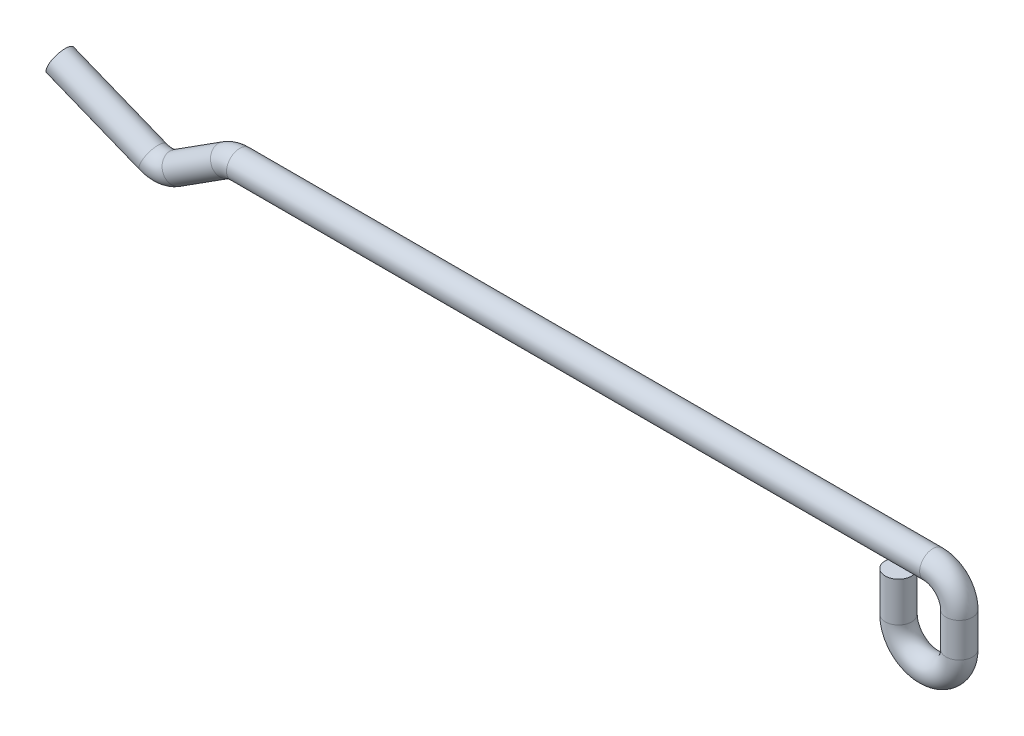
ISO-10303-21;
HEADER;
FILE_DESCRIPTION(('STEP AP214'),'2;1');
FILE_NAME('part.step','',(''),(''),'','','');
FILE_SCHEMA(('AUTOMOTIVE_DESIGN { 1 0 10303 214 1 1 1 1 }'));
ENDSEC;
DATA;
#1=APPLICATION_CONTEXT('core data for automotive mechanical design processes');
#2=APPLICATION_PROTOCOL_DEFINITION('international standard','automotive_design',2000,#1);
#3=PRODUCT_CONTEXT('',#1,'mechanical');
#4=PRODUCT('Part','Part','',(#3));
#5=PRODUCT_RELATED_PRODUCT_CATEGORY('part','',(#4));
#6=PRODUCT_DEFINITION_FORMATION('','',#4);
#7=PRODUCT_DEFINITION_CONTEXT('part definition',#1,'design');
#8=PRODUCT_DEFINITION('design','',#6,#7);
#9=PRODUCT_DEFINITION_SHAPE('','',#8);
#10=(LENGTH_UNIT() NAMED_UNIT(*) SI_UNIT(.MILLI.,.METRE.));
#11=(NAMED_UNIT(*) PLANE_ANGLE_UNIT() SI_UNIT($,.RADIAN.));
#12=(NAMED_UNIT(*) SI_UNIT($,.STERADIAN.) SOLID_ANGLE_UNIT());
#13=UNCERTAINTY_MEASURE_WITH_UNIT(LENGTH_MEASURE(1.E-05),#10,'distance_accuracy_value','');
#14=(GEOMETRIC_REPRESENTATION_CONTEXT(3) GLOBAL_UNCERTAINTY_ASSIGNED_CONTEXT((#13)) GLOBAL_UNIT_ASSIGNED_CONTEXT((#10,
#11,#12)) REPRESENTATION_CONTEXT('',''));
#15=CARTESIAN_POINT('',(0.,0.,0.));
#16=DIRECTION('',(0.,0.,1.));
#17=DIRECTION('',(1.,0.,0.));
#18=AXIS2_PLACEMENT_3D('',#15,#16,#17);
#19=CARTESIAN_POINT('',(-56.3710232392201,-1.2177613136877,0.));
#20=DIRECTION('',(-0.928195443882563,0.372093023255814,0.));
#21=DIRECTION('',(-0.372093023255814,-0.928195443882563,0.));
#22=AXIS2_PLACEMENT_3D('',#19,#20,#21);
#23=CYLINDRICAL_SURFACE('',#22,1.);
#24=CARTESIAN_POINT('',(-56.3710232392201,-1.2177613136877,0.));
#25=DIRECTION('',(-0.928195443882568,0.372093023255802,0.));
#26=DIRECTION('',(0.,0.,-1.));
#27=AXIS2_PLACEMENT_3D('',#24,#25,#26);
#28=CIRCLE('',#27,1.);
#29=CARTESIAN_POINT('',(-56.7431162624759,-2.14595675757027,0.));
#30=VERTEX_POINT('',#29);
#31=EDGE_CURVE('E45',#30,#30,#28,.T.);
#32=CARTESIAN_POINT('',(-63.4,1.6,0.));
#33=DIRECTION('',(-0.928195443882568,0.372093023255802,0.));
#34=DIRECTION('',(0.,0.,-1.));
#35=AXIS2_PLACEMENT_3D('',#32,#33,#34);
#36=CIRCLE('',#35,1.);
#37=CARTESIAN_POINT('',(-63.7720930232558,0.671804556117432,0.));
#38=VERTEX_POINT('',#37);
#39=EDGE_CURVE('E10',#38,#38,#36,.T.);
#40=CARTESIAN_POINT('',(-56.7431162624759,-2.14595675757027,0.));
#41=CARTESIAN_POINT('',(-56.8163347704007,-2.11660507721935,0.));
#42=CARTESIAN_POINT('',(-56.8895532783255,-2.08725339686844,0.));
#43=CARTESIAN_POINT('',(-57.0359902941751,-2.02855003616661,0.));
#44=CARTESIAN_POINT('',(-57.1092088020998,-1.9991983558157,0.));
#45=CARTESIAN_POINT('',(-57.2556458179494,-1.94049499511387,0.));
#46=CARTESIAN_POINT('',(-57.3288643258742,-1.91114331476296,0.));
#47=CARTESIAN_POINT('',(-57.4753013417238,-1.85243995406113,0.));
#48=CARTESIAN_POINT('',(-57.5485198496486,-1.82308827371022,0.));
#49=CARTESIAN_POINT('',(-57.6949568654982,-1.76438491300839,0.));
#50=CARTESIAN_POINT('',(-57.768175373423,-1.73503323265748,0.));
#51=CARTESIAN_POINT('',(-57.9146123892726,-1.67632987195565,0.));
#52=CARTESIAN_POINT('',(-57.9878308971973,-1.64697819160474,0.));
#53=CARTESIAN_POINT('',(-58.1342679130469,-1.58827483090291,0.));
#54=CARTESIAN_POINT('',(-58.2074864209717,-1.55892315055199,0.));
#55=CARTESIAN_POINT('',(-58.3539234368213,-1.50021978985017,0.));
#56=CARTESIAN_POINT('',(-58.4271419447461,-1.47086810949926,0.));
#57=CARTESIAN_POINT('',(-58.5735789605957,-1.41216474879743,0.));
#58=CARTESIAN_POINT('',(-58.6467974685205,-1.38281306844651,0.));
#59=CARTESIAN_POINT('',(-58.79323448437,-1.32410970774469,0.));
#60=CARTESIAN_POINT('',(-58.8664529922948,-1.29475802739377,0.));
#61=CARTESIAN_POINT('',(-59.0128900081444,-1.23605466669195,0.));
#62=CARTESIAN_POINT('',(-59.0861085160692,-1.20670298634103,0.));
#63=CARTESIAN_POINT('',(-59.2325455319188,-1.14799962563921,0.));
#64=CARTESIAN_POINT('',(-59.3057640398436,-1.11864794528829,0.));
#65=CARTESIAN_POINT('',(-59.4522010556932,-1.05994458458647,0.));
#66=CARTESIAN_POINT('',(-59.525419563618,-1.03059290423555,0.));
#67=CARTESIAN_POINT('',(-59.6718565794675,-0.971889543533725,0.));
#68=CARTESIAN_POINT('',(-59.7450750873923,-0.942537863182811,0.));
#69=CARTESIAN_POINT('',(-59.8915121032419,-0.883834502480984,0.));
#70=CARTESIAN_POINT('',(-59.9647306111667,-0.854482822130071,0.));
#71=CARTESIAN_POINT('',(-60.1111676270163,-0.795779461428244,0.));
#72=CARTESIAN_POINT('',(-60.1843861349411,-0.76642778107733,0.));
#73=CARTESIAN_POINT('',(-60.3308231507907,-0.707724420375503,0.));
#74=CARTESIAN_POINT('',(-60.4040416587154,-0.67837274002459,0.));
#75=CARTESIAN_POINT('',(-60.550478674565,-0.619669379322764,0.));
#76=CARTESIAN_POINT('',(-60.6236971824898,-0.590317698971849,0.));
#77=CARTESIAN_POINT('',(-60.7701341983394,-0.531614338270022,0.));
#78=CARTESIAN_POINT('',(-60.8433527062642,-0.502262657919108,0.));
#79=CARTESIAN_POINT('',(-60.9897897221138,-0.443559297217282,0.));
#80=CARTESIAN_POINT('',(-61.0630082300386,-0.414207616866369,0.));
#81=CARTESIAN_POINT('',(-61.2094452458882,-0.355504256164542,0.));
#82=CARTESIAN_POINT('',(-61.2826637538129,-0.326152575813627,0.));
#83=CARTESIAN_POINT('',(-61.4291007696625,-0.2674492151118,0.));
#84=CARTESIAN_POINT('',(-61.5023192775873,-0.238097534760888,0.));
#85=CARTESIAN_POINT('',(-61.6487562934369,-0.179394174059061,0.));
#86=CARTESIAN_POINT('',(-61.7219748013617,-0.150042493708146,0.));
#87=CARTESIAN_POINT('',(-61.8684118172113,-0.0913391330063192,0.));
#88=CARTESIAN_POINT('',(-61.9416303251361,-0.0619874526554063,0.));
#89=CARTESIAN_POINT('',(-62.0880673409856,-0.00328409195357959,0.));
#90=CARTESIAN_POINT('',(-62.1612858489104,0.0260675883973342,0.));
#91=CARTESIAN_POINT('',(-62.30772286476,0.0847709490991613,0.));
#92=CARTESIAN_POINT('',(-62.3809413726848,0.114122629450075,0.));
#93=CARTESIAN_POINT('',(-62.5273783885344,0.172825990151902,0.));
#94=CARTESIAN_POINT('',(-62.6005968964592,0.202177670502817,0.));
#95=CARTESIAN_POINT('',(-62.7470339123088,0.260881031204643,0.));
#96=CARTESIAN_POINT('',(-62.8202524202336,0.290232711555555,0.));
#97=CARTESIAN_POINT('',(-62.9666894360831,0.348936072257382,0.));
#98=CARTESIAN_POINT('',(-63.0399079440079,0.378287752608296,0.));
#99=CARTESIAN_POINT('',(-63.1863449598575,0.436991113310124,0.));
#100=CARTESIAN_POINT('',(-63.2595634677823,0.466342793661037,0.));
#101=CARTESIAN_POINT('',(-63.4060004836319,0.525046154362864,0.));
#102=CARTESIAN_POINT('',(-63.4792189915567,0.554397834713778,0.));
#103=CARTESIAN_POINT('',(-63.6256560074062,0.613101195415605,0.));
#104=CARTESIAN_POINT('',(-63.698874515331,0.642452875766518,0.));
#105=CARTESIAN_POINT('',(-63.7720930232558,0.671804556117432,0.));
#106=B_SPLINE_CURVE_WITH_KNOTS('',3,(#40,#41,#42,#43,#44,#45,#46,#47,#48,#49,#50,#51,#52,#53,
#54,#55,#56,#57,#58,#59,#60,#61,#62,#63,#64,#65,#66,#67,#68,#69,#70,#71,#72,#73,#74,#75,#76,#77,
#78,#79,#80,#81,#82,#83,#84,#85,#86,#87,#88,#89,#90,#91,#92,#93,#94,#95,#96,#97,#98,#99,#100,
#101,#102,#103,#104,#105),.UNSPECIFIED.,.F.,.F.,(4,2,2,2,2,2,2,2,2,2,2,2,2,2,2,2,2,2,2,2,2,2,2,
2,2,2,2,2,2,2,2,2,4),(0.,0.236647922829238,0.473295845658475,0.709943768487719,
0.946591691316957,1.1832396141462,1.41988753697544,1.65653545980468,1.89318338263392,
2.12983130546316,2.3664792282924,2.60312715112164,2.83977507395088,3.07642299678012,
3.31307091960936,3.5497188424386,3.78636676526784,4.02301468809708,4.25966261092632,
4.49631053375556,4.7329584565848,4.96960637941404,5.20625430224328,5.44290222507252,
5.67955014790176,5.916198070731,6.15284599356024,6.38949391638948,6.62614183921873,
6.86278976204797,7.0994376848772,7.33608560770644,7.57273353053568),.UNSPECIFIED.);
#107=EDGE_CURVE('BSEAM39',#30,#38,#106,.T.);
#108=ORIENTED_EDGE('',*,*,#31,.T.);
#109=ORIENTED_EDGE('',*,*,#39,.F.);
#110=ORIENTED_EDGE('',*,*,#107,.T.);
#111=ORIENTED_EDGE('',*,*,#107,.F.);
#112=EDGE_LOOP('',(#108,#110,#109,#111));
#113=FACE_BOUND('',#112,.T.);
#114=ADVANCED_FACE('F39',(#113),#23,.T.);
#115=CARTESIAN_POINT('',(-55.6268371927084,0.638629574077423,0.));
#116=DIRECTION('',(0.,0.,1.));
#117=DIRECTION('',(-1.,0.,0.));
#118=AXIS2_PLACEMENT_3D('',#115,#116,#117);
#119=TOROIDAL_SURFACE('',#118,2.,1.);
#120=CARTESIAN_POINT('',(-54.5514043560066,-1.04762195334767,0.));
#121=DIRECTION('',(-0.843125763712528,-0.537716418350942,0.));
#122=DIRECTION('',(0.,0.,-1.));
#123=AXIS2_PLACEMENT_3D('',#120,#121,#122);
#124=CIRCLE('',#123,1.);
#125=CARTESIAN_POINT('',(-54.0136879376557,-1.89074771706021,0.));
#126=VERTEX_POINT('',#125);
#127=EDGE_CURVE('E49',#126,#126,#124,.T.);
#128=CARTESIAN_POINT('',(-55.6268371927084,0.638629574077423,0.));
#129=DIRECTION('',(0.,0.,1.));
#130=DIRECTION('',(-1.,0.,0.));
#131=AXIS2_PLACEMENT_3D('',#128,#129,#130);
#132=CIRCLE('',#131,3.);
#133=EDGE_CURVE('',#30,#126,#132,.T.);
#134=ORIENTED_EDGE('',*,*,#31,.F.);
#135=ORIENTED_EDGE('',*,*,#127,.T.);
#136=ORIENTED_EDGE('',*,*,#133,.T.);
#137=ORIENTED_EDGE('',*,*,#133,.F.);
#138=EDGE_LOOP('',(#134,#136,#135,#137));
#139=FACE_BOUND('',#138,.T.);
#140=ADVANCED_FACE('F95',(#139),#119,.T.);
#141=CARTESIAN_POINT('',(-50.8919496811435,1.28625152742505,0.));
#142=DIRECTION('',(-0.843125763712536,-0.53771641835093,0.));
#143=DIRECTION('',(0.53771641835093,-0.843125763712537,0.));
#144=AXIS2_PLACEMENT_3D('',#141,#142,#143);
#145=CYLINDRICAL_SURFACE('',#144,1.);
#146=CARTESIAN_POINT('',(-50.8919496811435,1.28625152742505,0.));
#147=DIRECTION('',(-0.843125763712528,-0.537716418350942,0.));
#148=DIRECTION('',(0.,0.,-1.));
#149=AXIS2_PLACEMENT_3D('',#146,#147,#148);
#150=CIRCLE('',#149,1.);
#151=CARTESIAN_POINT('',(-51.4296660994945,2.12937729113758,0.));
#152=VERTEX_POINT('',#151);
#153=EDGE_CURVE('E53',#152,#152,#150,.T.);
#154=ORIENTED_EDGE('',*,*,#153,.T.);
#155=EDGE_LOOP('',(#154));
#156=FACE_BOUND('',#155,.T.);
#157=ORIENTED_EDGE('',*,*,#127,.F.);
#158=EDGE_LOOP('',(#157));
#159=FACE_BOUND('',#158,.T.);
#160=ADVANCED_FACE('F99',(#156,#159),#145,.T.);
#161=CARTESIAN_POINT('',(-49.8165168444417,-0.400000000000007,0.));
#162=DIRECTION('',(0.,0.,-1.));
#163=DIRECTION('',(1.,0.,0.));
#164=AXIS2_PLACEMENT_3D('',#161,#162,#163);
#165=TOROIDAL_SURFACE('',#164,2.,1.);
#166=CARTESIAN_POINT('',(-49.8165168444417,1.59999999999999,0.));
#167=DIRECTION('',(-1.,0.,0.));
#168=DIRECTION('',(0.,0.,-1.));
#169=AXIS2_PLACEMENT_3D('',#166,#167,#168);
#170=CIRCLE('',#169,1.);
#171=CARTESIAN_POINT('',(-49.8165168444417,2.59999999999999,0.));
#172=VERTEX_POINT('',#171);
#173=EDGE_CURVE('E58',#172,#172,#170,.T.);
#174=CARTESIAN_POINT('',(-49.8165168444417,-0.400000000000007,0.));
#175=DIRECTION('',(0.,0.,-1.));
#176=DIRECTION('',(1.,0.,0.));
#177=AXIS2_PLACEMENT_3D('',#174,#175,#176);
#178=CIRCLE('',#177,3.);
#179=EDGE_CURVE('',#152,#172,#178,.T.);
#180=ORIENTED_EDGE('',*,*,#153,.F.);
#181=ORIENTED_EDGE('',*,*,#173,.T.);
#182=ORIENTED_EDGE('',*,*,#179,.T.);
#183=ORIENTED_EDGE('',*,*,#179,.F.);
#184=EDGE_LOOP('',(#180,#182,#181,#183));
#185=FACE_BOUND('',#184,.T.);
#186=ADVANCED_FACE('F105',(#185),#165,.T.);
#187=CARTESIAN_POINT('',(2.59999999999997,1.6,0.));
#188=DIRECTION('',(-1.,0.,0.));
#189=DIRECTION('',(0.,-1.,0.));
#190=AXIS2_PLACEMENT_3D('',#187,#188,#189);
#191=CYLINDRICAL_SURFACE('',#190,1.);
#192=CARTESIAN_POINT('',(2.59999999999997,1.6,0.));
#193=DIRECTION('',(-1.,0.,0.));
#194=DIRECTION('',(0.,0.,-1.));
#195=AXIS2_PLACEMENT_3D('',#192,#193,#194);
#196=CIRCLE('',#195,1.);
#197=CARTESIAN_POINT('',(2.59999999999995,2.6,0.));
#198=VERTEX_POINT('',#197);
#199=EDGE_CURVE('E61',#198,#198,#196,.T.);
#200=ORIENTED_EDGE('',*,*,#199,.T.);
#201=EDGE_LOOP('',(#200));
#202=FACE_BOUND('',#201,.T.);
#203=ORIENTED_EDGE('',*,*,#173,.F.);
#204=EDGE_LOOP('',(#203));
#205=FACE_BOUND('',#204,.T.);
#206=ADVANCED_FACE('F112',(#202,#205),#191,.T.);
#207=CARTESIAN_POINT('',(2.6,-0.4,0.));
#208=DIRECTION('',(0.,0.,-1.));
#209=DIRECTION('',(1.,0.,0.));
#210=AXIS2_PLACEMENT_3D('',#207,#208,#209);
#211=TOROIDAL_SURFACE('',#210,2.,1.);
#212=CARTESIAN_POINT('',(4.6,-0.399999999999969,0.));
#213=DIRECTION('',(0.,1.,0.));
#214=DIRECTION('',(0.,0.,-1.));
#215=AXIS2_PLACEMENT_3D('',#212,#213,#214);
#216=CIRCLE('',#215,1.);
#217=CARTESIAN_POINT('',(5.6,-0.399999999999953,0.));
#218=VERTEX_POINT('',#217);
#219=EDGE_CURVE('E64',#218,#218,#216,.T.);
#220=CARTESIAN_POINT('',(2.6,-0.4,0.));
#221=DIRECTION('',(0.,0.,-1.));
#222=DIRECTION('',(1.,0.,0.));
#223=AXIS2_PLACEMENT_3D('',#220,#221,#222);
#224=CIRCLE('',#223,3.);
#225=EDGE_CURVE('',#198,#218,#224,.T.);
#226=ORIENTED_EDGE('',*,*,#199,.F.);
#227=ORIENTED_EDGE('',*,*,#219,.T.);
#228=ORIENTED_EDGE('',*,*,#225,.T.);
#229=ORIENTED_EDGE('',*,*,#225,.F.);
#230=EDGE_LOOP('',(#226,#228,#227,#229));
#231=FACE_BOUND('',#230,.T.);
#232=ADVANCED_FACE('F116',(#231),#211,.T.);
#233=CARTESIAN_POINT('',(4.6,-2.99999999999997,0.));
#234=DIRECTION('',(0.,1.,0.));
#235=DIRECTION('',(0.,0.,-1.));
#236=AXIS2_PLACEMENT_3D('',#233,#234,#235);
#237=CYLINDRICAL_SURFACE('',#236,1.);
#238=CARTESIAN_POINT('',(4.6,-2.99999999999997,0.));
#239=DIRECTION('',(0.,1.,0.));
#240=DIRECTION('',(0.,0.,-1.));
#241=AXIS2_PLACEMENT_3D('',#238,#239,#240);
#242=CIRCLE('',#241,1.);
#243=CARTESIAN_POINT('',(5.6,-2.99999999999995,0.));
#244=VERTEX_POINT('',#243);
#245=EDGE_CURVE('E67',#244,#244,#242,.T.);
#246=ORIENTED_EDGE('',*,*,#245,.T.);
#247=EDGE_LOOP('',(#246));
#248=FACE_BOUND('',#247,.T.);
#249=ORIENTED_EDGE('',*,*,#219,.F.);
#250=EDGE_LOOP('',(#249));
#251=FACE_BOUND('',#250,.T.);
#252=ADVANCED_FACE('F120',(#248,#251),#237,.T.);
#253=CARTESIAN_POINT('',(2.3,-3.,0.));
#254=DIRECTION('',(0.,0.,-1.));
#255=DIRECTION('',(1.,0.,0.));
#256=AXIS2_PLACEMENT_3D('',#253,#254,#255);
#257=TOROIDAL_SURFACE('',#256,2.3,1.);
#258=CARTESIAN_POINT('',(0.,-3.,0.));
#259=DIRECTION('',(0.,-1.,0.));
#260=DIRECTION('',(0.,0.,-1.));
#261=AXIS2_PLACEMENT_3D('',#258,#259,#260);
#262=CIRCLE('',#261,1.);
#263=CARTESIAN_POINT('',(-1.,-3.,0.));
#264=VERTEX_POINT('',#263);
#265=EDGE_CURVE('E70',#264,#264,#262,.T.);
#266=CARTESIAN_POINT('',(2.3,-3.,0.));
#267=DIRECTION('',(0.,0.,-1.));
#268=DIRECTION('',(1.,0.,0.));
#269=AXIS2_PLACEMENT_3D('',#266,#267,#268);
#270=CIRCLE('',#269,3.3);
#271=EDGE_CURVE('',#244,#264,#270,.T.);
#272=ORIENTED_EDGE('',*,*,#245,.F.);
#273=ORIENTED_EDGE('',*,*,#265,.T.);
#274=ORIENTED_EDGE('',*,*,#271,.T.);
#275=ORIENTED_EDGE('',*,*,#271,.F.);
#276=EDGE_LOOP('',(#272,#274,#273,#275));
#277=FACE_BOUND('',#276,.T.);
#278=ADVANCED_FACE('F77',(#277),#257,.T.);
#279=CARTESIAN_POINT('',(0.,-3.,0.));
#280=DIRECTION('',(0.,1.,0.));
#281=DIRECTION('',(0.,0.,-1.));
#282=AXIS2_PLACEMENT_3D('',#279,#280,#281);
#283=CYLINDRICAL_SURFACE('',#282,1.);
#284=ORIENTED_EDGE('',*,*,#265,.F.);
#285=EDGE_LOOP('',(#284));
#286=FACE_BOUND('',#285,.T.);
#287=CARTESIAN_POINT('',(0.,0.,0.));
#288=DIRECTION('',(0.,-1.,0.));
#289=DIRECTION('',(0.,0.,-1.));
#290=AXIS2_PLACEMENT_3D('',#287,#288,#289);
#291=CIRCLE('',#290,1.);
#292=CARTESIAN_POINT('',(0.,0.,-1.));
#293=VERTEX_POINT('',#292);
#294=EDGE_CURVE('E71',#293,#293,#291,.T.);
#295=ORIENTED_EDGE('',*,*,#294,.T.);
#296=EDGE_LOOP('',(#295));
#297=FACE_BOUND('',#296,.T.);
#298=ADVANCED_FACE('F80',(#286,#297),#283,.T.);
#299=CARTESIAN_POINT('',(-63.4,1.6,0.));
#300=DIRECTION('',(0.928195443882568,-0.372093023255802,0.));
#301=DIRECTION('',(0.,0.,-1.));
#302=AXIS2_PLACEMENT_3D('',#299,#300,#301);
#303=PLANE('',#302);
#304=ORIENTED_EDGE('',*,*,#39,.T.);
#305=EDGE_LOOP('',(#304));
#306=FACE_BOUND('',#305,.T.);
#307=ADVANCED_FACE('F83',(#306),#303,.F.);
#308=CARTESIAN_POINT('',(0.,0.,0.));
#309=DIRECTION('',(0.,1.,0.));
#310=DIRECTION('',(0.,0.,-1.));
#311=AXIS2_PLACEMENT_3D('',#308,#309,#310);
#312=PLANE('',#311);
#313=ORIENTED_EDGE('',*,*,#294,.F.);
#314=EDGE_LOOP('',(#313));
#315=FACE_BOUND('',#314,.T.);
#316=ADVANCED_FACE('F87',(#315),#312,.T.);
#317=CLOSED_SHELL('',(#114,#140,#160,#186,#206,#232,#252,#278,#298,#307,#316));
#318=MANIFOLD_SOLID_BREP('B2',#317);
#319=ADVANCED_BREP_SHAPE_REPRESENTATION('',(#18,#318),#14);
#320=SHAPE_DEFINITION_REPRESENTATION(#9,#319);
ENDSEC;
END-ISO-10303-21;
